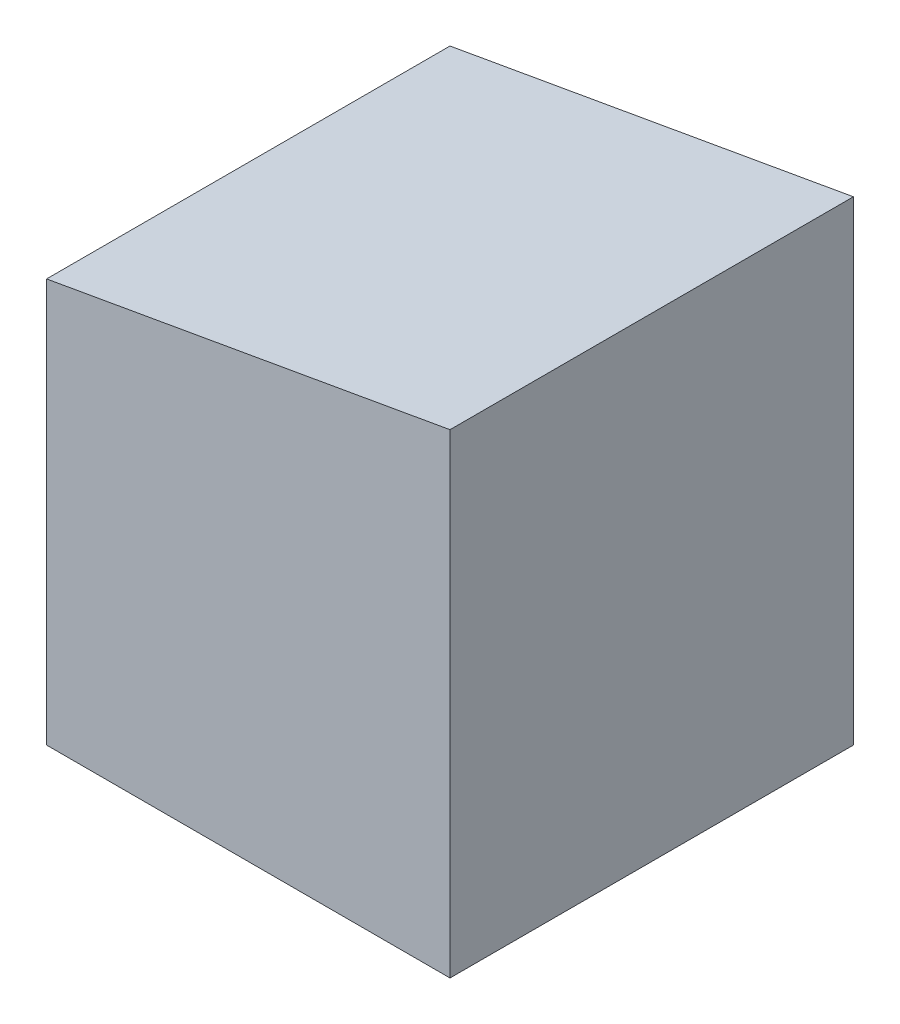
ISO-10303-21;
HEADER;
FILE_DESCRIPTION(('STEP AP214'),'2;1');
FILE_NAME('part.step','',(''),(''),'','','');
FILE_SCHEMA(('AUTOMOTIVE_DESIGN { 1 0 10303 214 1 1 1 1 }'));
ENDSEC;
DATA;
#1=APPLICATION_CONTEXT('core data for automotive mechanical design processes');
#2=APPLICATION_PROTOCOL_DEFINITION('international standard','automotive_design',2000,#1);
#3=PRODUCT_CONTEXT('',#1,'mechanical');
#4=PRODUCT('Part','Part','',(#3));
#5=PRODUCT_RELATED_PRODUCT_CATEGORY('part','',(#4));
#6=PRODUCT_DEFINITION_FORMATION('','',#4);
#7=PRODUCT_DEFINITION_CONTEXT('part definition',#1,'design');
#8=PRODUCT_DEFINITION('design','',#6,#7);
#9=PRODUCT_DEFINITION_SHAPE('','',#8);
#10=(LENGTH_UNIT() NAMED_UNIT(*) SI_UNIT(.MILLI.,.METRE.));
#11=(NAMED_UNIT(*) PLANE_ANGLE_UNIT() SI_UNIT($,.RADIAN.));
#12=(NAMED_UNIT(*) SI_UNIT($,.STERADIAN.) SOLID_ANGLE_UNIT());
#13=UNCERTAINTY_MEASURE_WITH_UNIT(LENGTH_MEASURE(1.E-05),#10,'distance_accuracy_value','');
#14=(GEOMETRIC_REPRESENTATION_CONTEXT(3) GLOBAL_UNCERTAINTY_ASSIGNED_CONTEXT((#13)) GLOBAL_UNIT_ASSIGNED_CONTEXT((#10,
#11,#12)) REPRESENTATION_CONTEXT('',''));
#15=CARTESIAN_POINT('',(0.,0.,0.));
#16=DIRECTION('',(0.,0.,1.));
#17=DIRECTION('',(1.,0.,0.));
#18=AXIS2_PLACEMENT_3D('',#15,#16,#17);
#19=CARTESIAN_POINT('',(44.45,104.648,44.45));
#20=DIRECTION('',(-1.,0.,0.));
#21=DIRECTION('',(0.,0.,1.));
#22=AXIS2_PLACEMENT_3D('',#19,#20,#21);
#23=PLANE('',#22);
#24=DIRECTION('',(0.,0.,-1.));
#25=VECTOR('',#24,1.);
#26=CARTESIAN_POINT('',(44.45,0.,44.45));
#27=LINE('',#26,#25);
#28=CARTESIAN_POINT('',(44.45,0.,44.45));
#29=VERTEX_POINT('',#28);
#30=CARTESIAN_POINT('',(44.45,0.,-44.45));
#31=VERTEX_POINT('',#30);
#32=EDGE_CURVE('E98',#29,#31,#27,.T.);
#33=ORIENTED_EDGE('',*,*,#32,.T.);
#34=DIRECTION('',(0.,-1.,0.));
#35=VECTOR('',#34,1.);
#36=CARTESIAN_POINT('',(44.45,104.648,-44.45));
#37=LINE('',#36,#35);
#38=CARTESIAN_POINT('',(44.45,104.648,-44.45));
#39=VERTEX_POINT('',#38);
#40=EDGE_CURVE('E11',#39,#31,#37,.T.);
#41=ORIENTED_EDGE('',*,*,#40,.F.);
#42=DIRECTION('',(0.,0.,-1.));
#43=VECTOR('',#42,1.);
#44=CARTESIAN_POINT('',(44.45,104.648,44.45));
#45=LINE('',#44,#43);
#46=CARTESIAN_POINT('',(44.45,104.648,44.45));
#47=VERTEX_POINT('',#46);
#48=EDGE_CURVE('E99',#47,#39,#45,.T.);
#49=ORIENTED_EDGE('',*,*,#48,.F.);
#50=DIRECTION('',(0.,-1.,0.));
#51=VECTOR('',#50,1.);
#52=CARTESIAN_POINT('',(44.45,104.648,44.45));
#53=LINE('',#52,#51);
#54=EDGE_CURVE('E85',#47,#29,#53,.T.);
#55=ORIENTED_EDGE('',*,*,#54,.T.);
#56=EDGE_LOOP('',(#33,#41,#49,#55));
#57=FACE_BOUND('',#56,.T.);
#58=ADVANCED_FACE('F45',(#57),#23,.F.);
#59=CARTESIAN_POINT('',(-44.45,104.648,-44.45));
#60=DIRECTION('',(0.,0.,1.));
#61=DIRECTION('',(1.,0.,0.));
#62=AXIS2_PLACEMENT_3D('',#59,#60,#61);
#63=PLANE('',#62);
#64=DIRECTION('',(0.,-1.,0.));
#65=VECTOR('',#64,1.);
#66=CARTESIAN_POINT('',(-44.45,104.648,-44.45));
#67=LINE('',#66,#65);
#68=CARTESIAN_POINT('',(-44.45,88.9725314150181,-44.45));
#69=VERTEX_POINT('',#68);
#70=CARTESIAN_POINT('',(-44.45,0.,-44.45));
#71=VERTEX_POINT('',#70);
#72=EDGE_CURVE('E53',#69,#71,#67,.T.);
#73=ORIENTED_EDGE('',*,*,#72,.F.);
#74=DIRECTION('',(0.984807753012209,0.173648177666924,0.));
#75=VECTOR('',#74,1.);
#76=CARTESIAN_POINT('',(-41.7693369939338,89.4452046291746,-44.45));
#77=LINE('',#76,#75);
#78=EDGE_CURVE('E111',#69,#39,#77,.T.);
#79=ORIENTED_EDGE('',*,*,#78,.T.);
#80=ORIENTED_EDGE('',*,*,#40,.T.);
#81=DIRECTION('',(-1.,0.,0.));
#82=VECTOR('',#81,1.);
#83=CARTESIAN_POINT('',(-44.45,0.,-44.45));
#84=LINE('',#83,#82);
#85=EDGE_CURVE('E93',#31,#71,#84,.T.);
#86=ORIENTED_EDGE('',*,*,#85,.T.);
#87=EDGE_LOOP('',(#73,#79,#80,#86));
#88=FACE_BOUND('',#87,.T.);
#89=ADVANCED_FACE('F113',(#88),#63,.F.);
#90=CARTESIAN_POINT('',(-44.45,104.648,44.45));
#91=DIRECTION('',(1.,0.,0.));
#92=DIRECTION('',(0.,0.,-1.));
#93=AXIS2_PLACEMENT_3D('',#90,#91,#92);
#94=PLANE('',#93);
#95=DIRECTION('',(0.,-1.,0.));
#96=VECTOR('',#95,1.);
#97=CARTESIAN_POINT('',(-44.45,104.648,44.45));
#98=LINE('',#97,#96);
#99=CARTESIAN_POINT('',(-44.45,88.9725314150181,44.45));
#100=VERTEX_POINT('',#99);
#101=CARTESIAN_POINT('',(-44.45,0.,44.45));
#102=VERTEX_POINT('',#101);
#103=EDGE_CURVE('E76',#100,#102,#98,.T.);
#104=ORIENTED_EDGE('',*,*,#103,.F.);
#105=DIRECTION('',(0.,0.,1.));
#106=VECTOR('',#105,1.);
#107=CARTESIAN_POINT('',(-44.45,88.9725314150181,-90.55));
#108=LINE('',#107,#106);
#109=EDGE_CURVE('E114',#69,#100,#108,.T.);
#110=ORIENTED_EDGE('',*,*,#109,.F.);
#111=ORIENTED_EDGE('',*,*,#72,.T.);
#112=DIRECTION('',(0.,0.,1.));
#113=VECTOR('',#112,1.);
#114=CARTESIAN_POINT('',(-44.45,0.,44.45));
#115=LINE('',#114,#113);
#116=EDGE_CURVE('E88',#71,#102,#115,.T.);
#117=ORIENTED_EDGE('',*,*,#116,.T.);
#118=EDGE_LOOP('',(#104,#110,#111,#117));
#119=FACE_BOUND('',#118,.T.);
#120=ADVANCED_FACE('F89',(#119),#94,.F.);
#121=CARTESIAN_POINT('',(-44.45,104.648,44.45));
#122=DIRECTION('',(0.,0.,-1.));
#123=DIRECTION('',(-1.,0.,0.));
#124=AXIS2_PLACEMENT_3D('',#121,#122,#123);
#125=PLANE('',#124);
#126=ORIENTED_EDGE('',*,*,#54,.F.);
#127=DIRECTION('',(0.984807753012209,0.173648177666924,0.));
#128=VECTOR('',#127,1.);
#129=CARTESIAN_POINT('',(44.45,104.648,44.45));
#130=LINE('',#129,#128);
#131=EDGE_CURVE('E60',#100,#47,#130,.T.);
#132=ORIENTED_EDGE('',*,*,#131,.F.);
#133=ORIENTED_EDGE('',*,*,#103,.T.);
#134=DIRECTION('',(1.,0.,0.));
#135=VECTOR('',#134,1.);
#136=CARTESIAN_POINT('',(-44.45,0.,44.45));
#137=LINE('',#136,#135);
#138=EDGE_CURVE('E80',#102,#29,#137,.T.);
#139=ORIENTED_EDGE('',*,*,#138,.T.);
#140=EDGE_LOOP('',(#126,#132,#133,#139));
#141=FACE_BOUND('',#140,.T.);
#142=ADVANCED_FACE('F78',(#141),#125,.F.);
#143=CARTESIAN_POINT('',(0.,0.,0.));
#144=DIRECTION('',(0.,-1.,0.));
#145=DIRECTION('',(0.,0.,-1.));
#146=AXIS2_PLACEMENT_3D('',#143,#144,#145);
#147=PLANE('',#146);
#148=ORIENTED_EDGE('',*,*,#32,.F.);
#149=ORIENTED_EDGE('',*,*,#138,.F.);
#150=ORIENTED_EDGE('',*,*,#116,.F.);
#151=ORIENTED_EDGE('',*,*,#85,.F.);
#152=EDGE_LOOP('',(#148,#149,#150,#151));
#153=FACE_BOUND('',#152,.T.);
#154=ADVANCED_FACE('F96',(#153),#147,.T.);
#155=CARTESIAN_POINT('',(44.45,104.648,-90.55));
#156=DIRECTION('',(0.173648177666924,-0.984807753012209,0.));
#157=DIRECTION('',(0.984807753012209,0.173648177666924,0.));
#158=AXIS2_PLACEMENT_3D('',#155,#156,#157);
#159=PLANE('',#158);
#160=ORIENTED_EDGE('',*,*,#109,.T.);
#161=ORIENTED_EDGE('',*,*,#131,.T.);
#162=ORIENTED_EDGE('',*,*,#48,.T.);
#163=ORIENTED_EDGE('',*,*,#78,.F.);
#164=EDGE_LOOP('',(#160,#161,#162,#163));
#165=FACE_BOUND('',#164,.T.);
#166=ADVANCED_FACE('F109',(#165),#159,.F.);
#167=CLOSED_SHELL('',(#58,#89,#120,#142,#154,#166));
#168=MANIFOLD_SOLID_BREP('B2',#167);
#169=ADVANCED_BREP_SHAPE_REPRESENTATION('',(#18,#168),#14);
#170=SHAPE_DEFINITION_REPRESENTATION(#9,#169);
ENDSEC;
END-ISO-10303-21;
